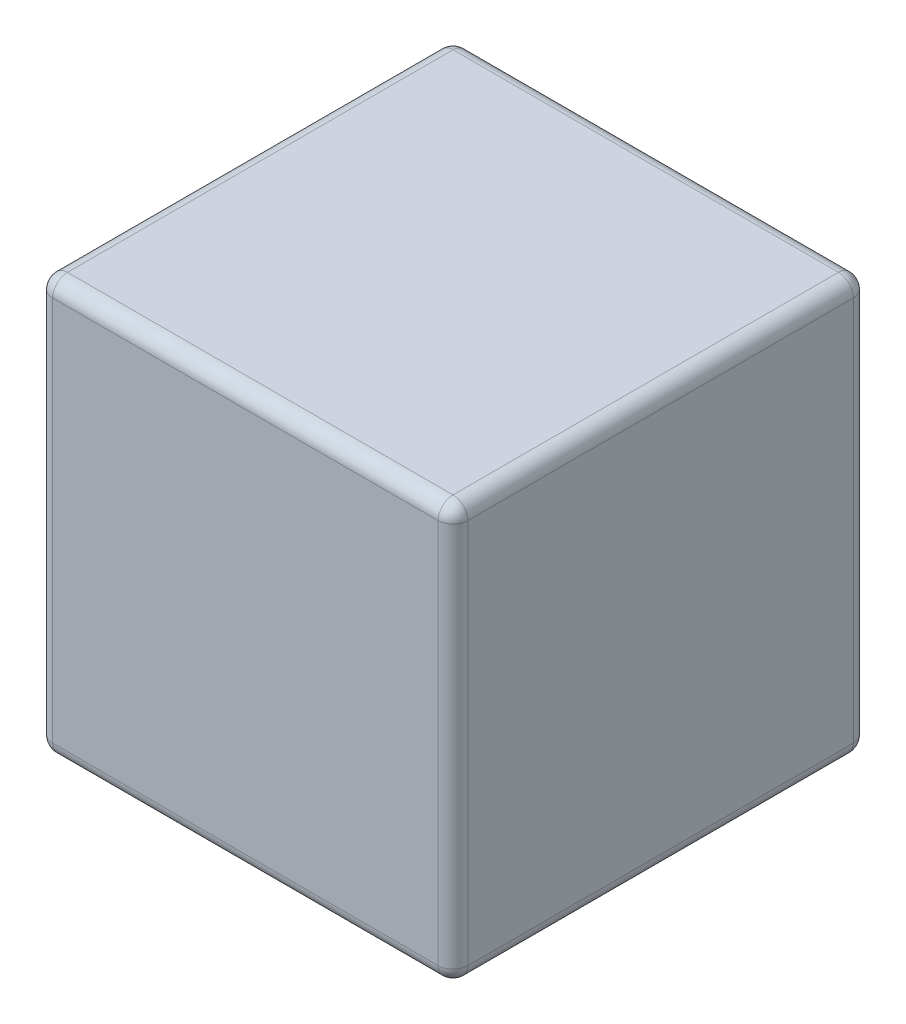
ISO-10303-21;
HEADER;
FILE_DESCRIPTION(('STEP AP214'),'2;1');
FILE_NAME('part.step','',(''),(''),'','','');
FILE_SCHEMA(('AUTOMOTIVE_DESIGN { 1 0 10303 214 1 1 1 1 }'));
ENDSEC;
DATA;
#1=APPLICATION_CONTEXT('core data for automotive mechanical design processes');
#2=APPLICATION_PROTOCOL_DEFINITION('international standard','automotive_design',2000,#1);
#3=PRODUCT_CONTEXT('',#1,'mechanical');
#4=PRODUCT('Part','Part','',(#3));
#5=PRODUCT_RELATED_PRODUCT_CATEGORY('part','',(#4));
#6=PRODUCT_DEFINITION_FORMATION('','',#4);
#7=PRODUCT_DEFINITION_CONTEXT('part definition',#1,'design');
#8=PRODUCT_DEFINITION('design','',#6,#7);
#9=PRODUCT_DEFINITION_SHAPE('','',#8);
#10=(LENGTH_UNIT() NAMED_UNIT(*) SI_UNIT(.MILLI.,.METRE.));
#11=(NAMED_UNIT(*) PLANE_ANGLE_UNIT() SI_UNIT($,.RADIAN.));
#12=(NAMED_UNIT(*) SI_UNIT($,.STERADIAN.) SOLID_ANGLE_UNIT());
#13=UNCERTAINTY_MEASURE_WITH_UNIT(LENGTH_MEASURE(1.E-05),#10,'distance_accuracy_value','');
#14=(GEOMETRIC_REPRESENTATION_CONTEXT(3) GLOBAL_UNCERTAINTY_ASSIGNED_CONTEXT((#13)) GLOBAL_UNIT_ASSIGNED_CONTEXT((#10,
#11,#12)) REPRESENTATION_CONTEXT('',''));
#15=CARTESIAN_POINT('',(0.,0.,0.));
#16=DIRECTION('',(0.,0.,1.));
#17=DIRECTION('',(1.,0.,0.));
#18=AXIS2_PLACEMENT_3D('',#15,#16,#17);
#19=CARTESIAN_POINT('',(28.,28.,-28.));
#20=DIRECTION('',(-1.,0.,0.));
#21=DIRECTION('',(0.,0.,1.));
#22=AXIS2_PLACEMENT_3D('',#19,#20,#21);
#23=PLANE('',#22);
#24=DIRECTION('',(0.,-1.,0.));
#25=VECTOR('',#24,1.);
#26=CARTESIAN_POINT('',(28.,28.,26.));
#27=LINE('',#26,#25);
#28=CARTESIAN_POINT('',(28.,26.,26.));
#29=VERTEX_POINT('',#28);
#30=CARTESIAN_POINT('',(28.,-26.,26.));
#31=VERTEX_POINT('',#30);
#32=EDGE_CURVE('E174',#29,#31,#27,.T.);
#33=ORIENTED_EDGE('',*,*,#32,.T.);
#34=DIRECTION('',(0.,0.,-1.));
#35=VECTOR('',#34,1.);
#36=CARTESIAN_POINT('',(28.,-26.,-28.));
#37=LINE('',#36,#35);
#38=CARTESIAN_POINT('',(28.,-26.,-26.));
#39=VERTEX_POINT('',#38);
#40=EDGE_CURVE('E179',#31,#39,#37,.T.);
#41=ORIENTED_EDGE('',*,*,#40,.T.);
#42=DIRECTION('',(0.,-1.,0.));
#43=VECTOR('',#42,1.);
#44=CARTESIAN_POINT('',(28.,28.,-26.));
#45=LINE('',#44,#43);
#46=CARTESIAN_POINT('',(28.,26.,-26.));
#47=VERTEX_POINT('',#46);
#48=EDGE_CURVE('E176',#39,#47,#45,.F.);
#49=ORIENTED_EDGE('',*,*,#48,.T.);
#50=DIRECTION('',(0.,0.,-1.));
#51=VECTOR('',#50,1.);
#52=CARTESIAN_POINT('',(28.,26.,28.));
#53=LINE('',#52,#51);
#54=EDGE_CURVE('E172',#47,#29,#53,.F.);
#55=ORIENTED_EDGE('',*,*,#54,.T.);
#56=EDGE_LOOP('',(#33,#41,#49,#55));
#57=FACE_BOUND('',#56,.T.);
#58=ADVANCED_FACE('F32',(#57),#23,.F.);
#59=CARTESIAN_POINT('',(-28.,28.,-28.));
#60=DIRECTION('',(0.,0.,1.));
#61=DIRECTION('',(1.,0.,0.));
#62=AXIS2_PLACEMENT_3D('',#59,#60,#61);
#63=PLANE('',#62);
#64=DIRECTION('',(0.,-1.,0.));
#65=VECTOR('',#64,1.);
#66=CARTESIAN_POINT('',(26.,28.,-28.));
#67=LINE('',#66,#65);
#68=CARTESIAN_POINT('',(26.,26.,-28.));
#69=VERTEX_POINT('',#68);
#70=CARTESIAN_POINT('',(26.,-26.,-28.));
#71=VERTEX_POINT('',#70);
#72=EDGE_CURVE('E165',#69,#71,#67,.T.);
#73=ORIENTED_EDGE('',*,*,#72,.T.);
#74=DIRECTION('',(-1.,0.,0.));
#75=VECTOR('',#74,1.);
#76=CARTESIAN_POINT('',(-28.,-26.,-28.));
#77=LINE('',#76,#75);
#78=CARTESIAN_POINT('',(-26.,-26.,-28.));
#79=VERTEX_POINT('',#78);
#80=EDGE_CURVE('E170',#71,#79,#77,.T.);
#81=ORIENTED_EDGE('',*,*,#80,.T.);
#82=DIRECTION('',(0.,-1.,0.));
#83=VECTOR('',#82,1.);
#84=CARTESIAN_POINT('',(-26.,28.,-28.));
#85=LINE('',#84,#83);
#86=CARTESIAN_POINT('',(-26.,26.,-28.));
#87=VERTEX_POINT('',#86);
#88=EDGE_CURVE('E167',#79,#87,#85,.F.);
#89=ORIENTED_EDGE('',*,*,#88,.T.);
#90=DIRECTION('',(-1.,0.,0.));
#91=VECTOR('',#90,1.);
#92=CARTESIAN_POINT('',(28.,26.,-28.));
#93=LINE('',#92,#91);
#94=EDGE_CURVE('E163',#87,#69,#93,.F.);
#95=ORIENTED_EDGE('',*,*,#94,.T.);
#96=EDGE_LOOP('',(#73,#81,#89,#95));
#97=FACE_BOUND('',#96,.T.);
#98=ADVANCED_FACE('F303',(#97),#63,.F.);
#99=CARTESIAN_POINT('',(-28.,28.,-28.));
#100=DIRECTION('',(1.,0.,0.));
#101=DIRECTION('',(0.,0.,-1.));
#102=AXIS2_PLACEMENT_3D('',#99,#100,#101);
#103=PLANE('',#102);
#104=DIRECTION('',(0.,-1.,0.));
#105=VECTOR('',#104,1.);
#106=CARTESIAN_POINT('',(-28.,28.,-26.));
#107=LINE('',#106,#105);
#108=CARTESIAN_POINT('',(-28.,26.,-26.));
#109=VERTEX_POINT('',#108);
#110=CARTESIAN_POINT('',(-28.,-26.,-26.));
#111=VERTEX_POINT('',#110);
#112=EDGE_CURVE('E131',#109,#111,#107,.T.);
#113=ORIENTED_EDGE('',*,*,#112,.T.);
#114=DIRECTION('',(0.,0.,1.));
#115=VECTOR('',#114,1.);
#116=CARTESIAN_POINT('',(-28.,-26.,-28.));
#117=LINE('',#116,#115);
#118=CARTESIAN_POINT('',(-28.,-26.,26.));
#119=VERTEX_POINT('',#118);
#120=EDGE_CURVE('E127',#111,#119,#117,.T.);
#121=ORIENTED_EDGE('',*,*,#120,.T.);
#122=DIRECTION('',(0.,-1.,0.));
#123=VECTOR('',#122,1.);
#124=CARTESIAN_POINT('',(-28.,28.,26.));
#125=LINE('',#124,#123);
#126=CARTESIAN_POINT('',(-28.,26.,26.));
#127=VERTEX_POINT('',#126);
#128=EDGE_CURVE('E119',#119,#127,#125,.F.);
#129=ORIENTED_EDGE('',*,*,#128,.T.);
#130=DIRECTION('',(0.,0.,1.));
#131=VECTOR('',#130,1.);
#132=CARTESIAN_POINT('',(-28.,26.,-28.));
#133=LINE('',#132,#131);
#134=EDGE_CURVE('E124',#127,#109,#133,.F.);
#135=ORIENTED_EDGE('',*,*,#134,.T.);
#136=EDGE_LOOP('',(#113,#121,#129,#135));
#137=FACE_BOUND('',#136,.T.);
#138=ADVANCED_FACE('F122',(#137),#103,.F.);
#139=CARTESIAN_POINT('',(-28.,28.,28.));
#140=DIRECTION('',(0.,0.,-1.));
#141=DIRECTION('',(-1.,0.,0.));
#142=AXIS2_PLACEMENT_3D('',#139,#140,#141);
#143=PLANE('',#142);
#144=DIRECTION('',(0.,-1.,0.));
#145=VECTOR('',#144,1.);
#146=CARTESIAN_POINT('',(-26.,28.,28.));
#147=LINE('',#146,#145);
#148=CARTESIAN_POINT('',(-26.,26.,28.));
#149=VERTEX_POINT('',#148);
#150=CARTESIAN_POINT('',(-26.,-26.,28.));
#151=VERTEX_POINT('',#150);
#152=EDGE_CURVE('E139',#149,#151,#147,.T.);
#153=ORIENTED_EDGE('',*,*,#152,.T.);
#154=DIRECTION('',(1.,0.,0.));
#155=VECTOR('',#154,1.);
#156=CARTESIAN_POINT('',(-28.,-26.,28.));
#157=LINE('',#156,#155);
#158=CARTESIAN_POINT('',(26.,-26.,28.));
#159=VERTEX_POINT('',#158);
#160=EDGE_CURVE('E186',#151,#159,#157,.T.);
#161=ORIENTED_EDGE('',*,*,#160,.T.);
#162=DIRECTION('',(0.,-1.,0.));
#163=VECTOR('',#162,1.);
#164=CARTESIAN_POINT('',(26.,28.,28.));
#165=LINE('',#164,#163);
#166=CARTESIAN_POINT('',(26.,26.,28.));
#167=VERTEX_POINT('',#166);
#168=EDGE_CURVE('E183',#159,#167,#165,.F.);
#169=ORIENTED_EDGE('',*,*,#168,.T.);
#170=DIRECTION('',(1.,0.,0.));
#171=VECTOR('',#170,1.);
#172=CARTESIAN_POINT('',(-28.,26.,28.));
#173=LINE('',#172,#171);
#174=EDGE_CURVE('E181',#167,#149,#173,.F.);
#175=ORIENTED_EDGE('',*,*,#174,.T.);
#176=EDGE_LOOP('',(#153,#161,#169,#175));
#177=FACE_BOUND('',#176,.T.);
#178=ADVANCED_FACE('F294',(#177),#143,.F.);
#179=CARTESIAN_POINT('',(0.,28.,0.));
#180=DIRECTION('',(0.,1.,0.));
#181=DIRECTION('',(0.,0.,1.));
#182=AXIS2_PLACEMENT_3D('',#179,#180,#181);
#183=PLANE('',#182);
#184=DIRECTION('',(0.,0.,1.));
#185=VECTOR('',#184,1.);
#186=CARTESIAN_POINT('',(-26.,28.,28.));
#187=LINE('',#186,#185);
#188=CARTESIAN_POINT('',(-26.,28.,-26.));
#189=VERTEX_POINT('',#188);
#190=CARTESIAN_POINT('',(-26.,28.,26.));
#191=VERTEX_POINT('',#190);
#192=EDGE_CURVE('E41',#189,#191,#187,.T.);
#193=ORIENTED_EDGE('',*,*,#192,.T.);
#194=DIRECTION('',(1.,0.,0.));
#195=VECTOR('',#194,1.);
#196=CARTESIAN_POINT('',(28.,28.,26.));
#197=LINE('',#196,#195);
#198=CARTESIAN_POINT('',(26.,28.,26.));
#199=VERTEX_POINT('',#198);
#200=EDGE_CURVE('E11',#191,#199,#197,.T.);
#201=ORIENTED_EDGE('',*,*,#200,.T.);
#202=DIRECTION('',(0.,0.,-1.));
#203=VECTOR('',#202,1.);
#204=CARTESIAN_POINT('',(26.,28.,-28.));
#205=LINE('',#204,#203);
#206=CARTESIAN_POINT('',(26.,28.,-26.));
#207=VERTEX_POINT('',#206);
#208=EDGE_CURVE('E197',#199,#207,#205,.T.);
#209=ORIENTED_EDGE('',*,*,#208,.T.);
#210=DIRECTION('',(-1.,0.,0.));
#211=VECTOR('',#210,1.);
#212=CARTESIAN_POINT('',(-28.,28.,-26.));
#213=LINE('',#212,#211);
#214=EDGE_CURVE('E52',#207,#189,#213,.T.);
#215=ORIENTED_EDGE('',*,*,#214,.T.);
#216=EDGE_LOOP('',(#193,#201,#209,#215));
#217=FACE_BOUND('',#216,.T.);
#218=ADVANCED_FACE('F296',(#217),#183,.T.);
#219=CARTESIAN_POINT('',(0.,-28.,0.));
#220=DIRECTION('',(0.,1.,0.));
#221=DIRECTION('',(0.,0.,1.));
#222=AXIS2_PLACEMENT_3D('',#219,#220,#221);
#223=PLANE('',#222);
#224=DIRECTION('',(0.,0.,1.));
#225=VECTOR('',#224,1.);
#226=CARTESIAN_POINT('',(-26.,-28.,0.));
#227=LINE('',#226,#225);
#228=CARTESIAN_POINT('',(-26.,-28.,26.));
#229=VERTEX_POINT('',#228);
#230=CARTESIAN_POINT('',(-26.,-28.,-26.));
#231=VERTEX_POINT('',#230);
#232=EDGE_CURVE('E192',#229,#231,#227,.F.);
#233=ORIENTED_EDGE('',*,*,#232,.T.);
#234=DIRECTION('',(-1.,0.,0.));
#235=VECTOR('',#234,1.);
#236=CARTESIAN_POINT('',(0.,-28.,-26.));
#237=LINE('',#236,#235);
#238=CARTESIAN_POINT('',(26.,-28.,-26.));
#239=VERTEX_POINT('',#238);
#240=EDGE_CURVE('E194',#231,#239,#237,.F.);
#241=ORIENTED_EDGE('',*,*,#240,.T.);
#242=DIRECTION('',(0.,0.,-1.));
#243=VECTOR('',#242,1.);
#244=CARTESIAN_POINT('',(26.,-28.,0.));
#245=LINE('',#244,#243);
#246=CARTESIAN_POINT('',(26.,-28.,26.));
#247=VERTEX_POINT('',#246);
#248=EDGE_CURVE('E188',#239,#247,#245,.F.);
#249=ORIENTED_EDGE('',*,*,#248,.T.);
#250=DIRECTION('',(1.,0.,0.));
#251=VECTOR('',#250,1.);
#252=CARTESIAN_POINT('',(0.,-28.,26.));
#253=LINE('',#252,#251);
#254=EDGE_CURVE('E190',#247,#229,#253,.F.);
#255=ORIENTED_EDGE('',*,*,#254,.T.);
#256=EDGE_LOOP('',(#233,#241,#249,#255));
#257=FACE_BOUND('',#256,.T.);
#258=ADVANCED_FACE('F264',(#257),#223,.F.);
#259=CARTESIAN_POINT('',(26.,28.,26.));
#260=DIRECTION('',(0.,-1.,0.));
#261=DIRECTION('',(0.,0.,-1.));
#262=AXIS2_PLACEMENT_3D('',#259,#260,#261);
#263=CYLINDRICAL_SURFACE('',#262,2.);
#264=CARTESIAN_POINT('',(26.,26.,26.));
#265=DIRECTION('',(0.,1.,0.));
#266=DIRECTION('',(0.,0.,1.));
#267=AXIS2_PLACEMENT_3D('',#264,#265,#266);
#268=CIRCLE('',#267,2.);
#269=EDGE_CURVE('E36',#167,#29,#268,.T.);
#270=ORIENTED_EDGE('',*,*,#269,.F.);
#271=ORIENTED_EDGE('',*,*,#168,.F.);
#272=CARTESIAN_POINT('',(26.,-26.,26.));
#273=DIRECTION('',(0.,-1.,0.));
#274=DIRECTION('',(0.,0.,-1.));
#275=AXIS2_PLACEMENT_3D('',#272,#273,#274);
#276=CIRCLE('',#275,2.);
#277=EDGE_CURVE('E159',#31,#159,#276,.T.);
#278=ORIENTED_EDGE('',*,*,#277,.F.);
#279=ORIENTED_EDGE('',*,*,#32,.F.);
#280=EDGE_LOOP('',(#270,#271,#278,#279));
#281=FACE_BOUND('',#280,.T.);
#282=ADVANCED_FACE('F34',(#281),#263,.T.);
#283=CARTESIAN_POINT('',(26.,26.,26.));
#284=DIRECTION('',(0.,0.,1.));
#285=DIRECTION('',(1.,0.,0.));
#286=AXIS2_PLACEMENT_3D('',#283,#284,#285);
#287=SPHERICAL_SURFACE('',#286,2.);
#288=CARTESIAN_POINT('',(26.,26.,26.));
#289=DIRECTION('',(1.,0.,0.));
#290=DIRECTION('',(0.,0.,-1.));
#291=AXIS2_PLACEMENT_3D('',#288,#289,#290);
#292=CIRCLE('',#291,2.);
#293=EDGE_CURVE('E242',#167,#199,#292,.F.);
#294=ORIENTED_EDGE('',*,*,#293,.F.);
#295=ORIENTED_EDGE('',*,*,#269,.T.);
#296=CARTESIAN_POINT('',(26.,26.,26.));
#297=DIRECTION('',(0.,0.,1.));
#298=DIRECTION('',(1.,0.,0.));
#299=AXIS2_PLACEMENT_3D('',#296,#297,#298);
#300=CIRCLE('',#299,2.);
#301=EDGE_CURVE('E245',#199,#29,#300,.F.);
#302=ORIENTED_EDGE('',*,*,#301,.F.);
#303=EDGE_LOOP('',(#294,#295,#302));
#304=FACE_BOUND('',#303,.T.);
#305=ADVANCED_FACE('F289',(#304),#287,.T.);
#306=CARTESIAN_POINT('',(26.,-26.,26.));
#307=DIRECTION('',(0.,0.,1.));
#308=DIRECTION('',(1.,0.,0.));
#309=AXIS2_PLACEMENT_3D('',#306,#307,#308);
#310=SPHERICAL_SURFACE('',#309,2.);
#311=CARTESIAN_POINT('',(26.,-26.,26.));
#312=DIRECTION('',(0.,0.,1.));
#313=DIRECTION('',(1.,0.,0.));
#314=AXIS2_PLACEMENT_3D('',#311,#312,#313);
#315=CIRCLE('',#314,2.);
#316=EDGE_CURVE('E236',#31,#247,#315,.F.);
#317=ORIENTED_EDGE('',*,*,#316,.F.);
#318=ORIENTED_EDGE('',*,*,#277,.T.);
#319=CARTESIAN_POINT('',(26.,-26.,26.));
#320=DIRECTION('',(1.,0.,0.));
#321=DIRECTION('',(0.,0.,-1.));
#322=AXIS2_PLACEMENT_3D('',#319,#320,#321);
#323=CIRCLE('',#322,2.);
#324=EDGE_CURVE('E239',#247,#159,#323,.F.);
#325=ORIENTED_EDGE('',*,*,#324,.F.);
#326=EDGE_LOOP('',(#317,#318,#325));
#327=FACE_BOUND('',#326,.T.);
#328=ADVANCED_FACE('F252',(#327),#310,.T.);
#329=CARTESIAN_POINT('',(26.,26.,0.));
#330=DIRECTION('',(0.,0.,1.));
#331=DIRECTION('',(1.,0.,0.));
#332=AXIS2_PLACEMENT_3D('',#329,#330,#331);
#333=CYLINDRICAL_SURFACE('',#332,2.);
#334=ORIENTED_EDGE('',*,*,#301,.T.);
#335=ORIENTED_EDGE('',*,*,#54,.F.);
#336=CARTESIAN_POINT('',(26.,26.,-26.));
#337=DIRECTION('',(0.,0.,-1.));
#338=DIRECTION('',(-1.,0.,0.));
#339=AXIS2_PLACEMENT_3D('',#336,#337,#338);
#340=CIRCLE('',#339,2.);
#341=EDGE_CURVE('E231',#207,#47,#340,.T.);
#342=ORIENTED_EDGE('',*,*,#341,.F.);
#343=ORIENTED_EDGE('',*,*,#208,.F.);
#344=EDGE_LOOP('',(#334,#335,#342,#343));
#345=FACE_BOUND('',#344,.T.);
#346=ADVANCED_FACE('F284',(#345),#333,.T.);
#347=CARTESIAN_POINT('',(0.,26.,26.));
#348=DIRECTION('',(-1.,0.,0.));
#349=DIRECTION('',(0.,0.,1.));
#350=AXIS2_PLACEMENT_3D('',#347,#348,#349);
#351=CYLINDRICAL_SURFACE('',#350,2.);
#352=ORIENTED_EDGE('',*,*,#293,.T.);
#353=ORIENTED_EDGE('',*,*,#200,.F.);
#354=CARTESIAN_POINT('',(-26.,26.,26.));
#355=DIRECTION('',(-1.,0.,0.));
#356=DIRECTION('',(0.,0.,1.));
#357=AXIS2_PLACEMENT_3D('',#354,#355,#356);
#358=CIRCLE('',#357,2.);
#359=EDGE_CURVE('E143',#149,#191,#358,.T.);
#360=ORIENTED_EDGE('',*,*,#359,.F.);
#361=ORIENTED_EDGE('',*,*,#174,.F.);
#362=EDGE_LOOP('',(#352,#353,#360,#361));
#363=FACE_BOUND('',#362,.T.);
#364=ADVANCED_FACE('F292',(#363),#351,.T.);
#365=CARTESIAN_POINT('',(-26.,28.,26.));
#366=DIRECTION('',(0.,-1.,0.));
#367=DIRECTION('',(0.,0.,-1.));
#368=AXIS2_PLACEMENT_3D('',#365,#366,#367);
#369=CYLINDRICAL_SURFACE('',#368,2.);
#370=CARTESIAN_POINT('',(-26.,-26.,26.));
#371=DIRECTION('',(0.,-1.,0.));
#372=DIRECTION('',(0.,0.,-1.));
#373=AXIS2_PLACEMENT_3D('',#370,#371,#372);
#374=CIRCLE('',#373,2.);
#375=EDGE_CURVE('E144',#151,#119,#374,.T.);
#376=ORIENTED_EDGE('',*,*,#375,.F.);
#377=ORIENTED_EDGE('',*,*,#152,.F.);
#378=CARTESIAN_POINT('',(-26.,26.,26.));
#379=DIRECTION('',(0.,1.,0.));
#380=DIRECTION('',(0.,0.,1.));
#381=AXIS2_PLACEMENT_3D('',#378,#379,#380);
#382=CIRCLE('',#381,2.);
#383=EDGE_CURVE('E135',#127,#149,#382,.T.);
#384=ORIENTED_EDGE('',*,*,#383,.F.);
#385=ORIENTED_EDGE('',*,*,#128,.F.);
#386=EDGE_LOOP('',(#376,#377,#384,#385));
#387=FACE_BOUND('',#386,.T.);
#388=ADVANCED_FACE('F137',(#387),#369,.T.);
#389=CARTESIAN_POINT('',(-28.,-26.,26.));
#390=DIRECTION('',(1.,0.,0.));
#391=DIRECTION('',(0.,0.,-1.));
#392=AXIS2_PLACEMENT_3D('',#389,#390,#391);
#393=CYLINDRICAL_SURFACE('',#392,2.);
#394=ORIENTED_EDGE('',*,*,#324,.T.);
#395=ORIENTED_EDGE('',*,*,#160,.F.);
#396=CARTESIAN_POINT('',(-26.,-26.,26.));
#397=DIRECTION('',(-1.,0.,0.));
#398=DIRECTION('',(0.,0.,1.));
#399=AXIS2_PLACEMENT_3D('',#396,#397,#398);
#400=CIRCLE('',#399,2.);
#401=EDGE_CURVE('E227',#229,#151,#400,.T.);
#402=ORIENTED_EDGE('',*,*,#401,.F.);
#403=ORIENTED_EDGE('',*,*,#254,.F.);
#404=EDGE_LOOP('',(#394,#395,#402,#403));
#405=FACE_BOUND('',#404,.T.);
#406=ADVANCED_FACE('F260',(#405),#393,.T.);
#407=CARTESIAN_POINT('',(26.,-26.,-28.));
#408=DIRECTION('',(0.,0.,-1.));
#409=DIRECTION('',(-1.,0.,0.));
#410=AXIS2_PLACEMENT_3D('',#407,#408,#409);
#411=CYLINDRICAL_SURFACE('',#410,2.);
#412=ORIENTED_EDGE('',*,*,#316,.T.);
#413=ORIENTED_EDGE('',*,*,#248,.F.);
#414=CARTESIAN_POINT('',(26.,-26.,-26.));
#415=DIRECTION('',(0.,0.,-1.));
#416=DIRECTION('',(-1.,0.,0.));
#417=AXIS2_PLACEMENT_3D('',#414,#415,#416);
#418=CIRCLE('',#417,2.);
#419=EDGE_CURVE('E224',#39,#239,#418,.T.);
#420=ORIENTED_EDGE('',*,*,#419,.F.);
#421=ORIENTED_EDGE('',*,*,#40,.F.);
#422=EDGE_LOOP('',(#412,#413,#420,#421));
#423=FACE_BOUND('',#422,.T.);
#424=ADVANCED_FACE('F270',(#423),#411,.T.);
#425=CARTESIAN_POINT('',(26.,28.,-26.));
#426=DIRECTION('',(0.,-1.,0.));
#427=DIRECTION('',(0.,0.,-1.));
#428=AXIS2_PLACEMENT_3D('',#425,#426,#427);
#429=CYLINDRICAL_SURFACE('',#428,2.);
#430=CARTESIAN_POINT('',(26.,26.,-26.));
#431=DIRECTION('',(0.,1.,0.));
#432=DIRECTION('',(0.,0.,1.));
#433=AXIS2_PLACEMENT_3D('',#430,#431,#432);
#434=CIRCLE('',#433,2.);
#435=EDGE_CURVE('E233',#47,#69,#434,.T.);
#436=ORIENTED_EDGE('',*,*,#435,.F.);
#437=ORIENTED_EDGE('',*,*,#48,.F.);
#438=CARTESIAN_POINT('',(26.,-26.,-26.));
#439=DIRECTION('',(0.,-1.,0.));
#440=DIRECTION('',(0.,0.,-1.));
#441=AXIS2_PLACEMENT_3D('',#438,#439,#440);
#442=CIRCLE('',#441,2.);
#443=EDGE_CURVE('E221',#71,#39,#442,.T.);
#444=ORIENTED_EDGE('',*,*,#443,.F.);
#445=ORIENTED_EDGE('',*,*,#72,.F.);
#446=EDGE_LOOP('',(#436,#437,#444,#445));
#447=FACE_BOUND('',#446,.T.);
#448=ADVANCED_FACE('F276',(#447),#429,.T.);
#449=CARTESIAN_POINT('',(26.,26.,-26.));
#450=DIRECTION('',(0.,0.,1.));
#451=DIRECTION('',(1.,0.,0.));
#452=AXIS2_PLACEMENT_3D('',#449,#450,#451);
#453=SPHERICAL_SURFACE('',#452,2.);
#454=ORIENTED_EDGE('',*,*,#341,.T.);
#455=ORIENTED_EDGE('',*,*,#435,.T.);
#456=CARTESIAN_POINT('',(26.,26.,-26.));
#457=DIRECTION('',(1.,0.,0.));
#458=DIRECTION('',(0.,1.,0.));
#459=AXIS2_PLACEMENT_3D('',#456,#457,#458);
#460=CIRCLE('',#459,2.);
#461=EDGE_CURVE('E150',#207,#69,#460,.F.);
#462=ORIENTED_EDGE('',*,*,#461,.F.);
#463=EDGE_LOOP('',(#454,#455,#462));
#464=FACE_BOUND('',#463,.T.);
#465=ADVANCED_FACE('F350',(#464),#453,.T.);
#466=CARTESIAN_POINT('',(-26.,26.,26.));
#467=DIRECTION('',(0.,0.,1.));
#468=DIRECTION('',(1.,0.,0.));
#469=AXIS2_PLACEMENT_3D('',#466,#467,#468);
#470=SPHERICAL_SURFACE('',#469,2.);
#471=ORIENTED_EDGE('',*,*,#383,.T.);
#472=ORIENTED_EDGE('',*,*,#359,.T.);
#473=CARTESIAN_POINT('',(-26.,26.,26.));
#474=DIRECTION('',(0.,0.,1.));
#475=DIRECTION('',(1.,0.,0.));
#476=AXIS2_PLACEMENT_3D('',#473,#474,#475);
#477=CIRCLE('',#476,2.);
#478=EDGE_CURVE('E147',#127,#191,#477,.F.);
#479=ORIENTED_EDGE('',*,*,#478,.F.);
#480=EDGE_LOOP('',(#471,#472,#479));
#481=FACE_BOUND('',#480,.T.);
#482=ADVANCED_FACE('F148',(#481),#470,.T.);
#483=CARTESIAN_POINT('',(-26.,-26.,26.));
#484=DIRECTION('',(0.,0.,1.));
#485=DIRECTION('',(1.,0.,0.));
#486=AXIS2_PLACEMENT_3D('',#483,#484,#485);
#487=SPHERICAL_SURFACE('',#486,2.);
#488=ORIENTED_EDGE('',*,*,#401,.T.);
#489=ORIENTED_EDGE('',*,*,#375,.T.);
#490=CARTESIAN_POINT('',(-26.,-26.,26.));
#491=DIRECTION('',(0.,0.,1.));
#492=DIRECTION('',(1.,0.,0.));
#493=AXIS2_PLACEMENT_3D('',#490,#491,#492);
#494=CIRCLE('',#493,2.);
#495=EDGE_CURVE('E151',#229,#119,#494,.F.);
#496=ORIENTED_EDGE('',*,*,#495,.F.);
#497=EDGE_LOOP('',(#488,#489,#496));
#498=FACE_BOUND('',#497,.T.);
#499=ADVANCED_FACE('F343',(#498),#487,.T.);
#500=CARTESIAN_POINT('',(26.,-26.,-26.));
#501=DIRECTION('',(0.,0.,1.));
#502=DIRECTION('',(1.,0.,0.));
#503=AXIS2_PLACEMENT_3D('',#500,#501,#502);
#504=SPHERICAL_SURFACE('',#503,2.);
#505=ORIENTED_EDGE('',*,*,#443,.T.);
#506=ORIENTED_EDGE('',*,*,#419,.T.);
#507=CARTESIAN_POINT('',(26.,-26.,-26.));
#508=DIRECTION('',(1.,0.,0.));
#509=DIRECTION('',(0.,0.,-1.));
#510=AXIS2_PLACEMENT_3D('',#507,#508,#509);
#511=CIRCLE('',#510,2.);
#512=EDGE_CURVE('E215',#71,#239,#511,.F.);
#513=ORIENTED_EDGE('',*,*,#512,.F.);
#514=EDGE_LOOP('',(#505,#506,#513));
#515=FACE_BOUND('',#514,.T.);
#516=ADVANCED_FACE('F339',(#515),#504,.T.);
#517=CARTESIAN_POINT('',(0.,26.,-26.));
#518=DIRECTION('',(1.,0.,0.));
#519=DIRECTION('',(0.,0.,-1.));
#520=AXIS2_PLACEMENT_3D('',#517,#518,#519);
#521=CYLINDRICAL_SURFACE('',#520,2.);
#522=ORIENTED_EDGE('',*,*,#461,.T.);
#523=ORIENTED_EDGE('',*,*,#94,.F.);
#524=CARTESIAN_POINT('',(-26.,26.,-26.));
#525=DIRECTION('',(-1.,0.,0.));
#526=DIRECTION('',(0.,0.,1.));
#527=AXIS2_PLACEMENT_3D('',#524,#525,#526);
#528=CIRCLE('',#527,2.);
#529=EDGE_CURVE('E212',#189,#87,#528,.T.);
#530=ORIENTED_EDGE('',*,*,#529,.F.);
#531=ORIENTED_EDGE('',*,*,#214,.F.);
#532=EDGE_LOOP('',(#522,#523,#530,#531));
#533=FACE_BOUND('',#532,.T.);
#534=ADVANCED_FACE('F336',(#533),#521,.T.);
#535=CARTESIAN_POINT('',(-26.,26.,0.));
#536=DIRECTION('',(0.,0.,-1.));
#537=DIRECTION('',(-1.,0.,0.));
#538=AXIS2_PLACEMENT_3D('',#535,#536,#537);
#539=CYLINDRICAL_SURFACE('',#538,2.);
#540=ORIENTED_EDGE('',*,*,#478,.T.);
#541=ORIENTED_EDGE('',*,*,#192,.F.);
#542=CARTESIAN_POINT('',(-26.,26.,-26.));
#543=DIRECTION('',(0.,0.,-1.));
#544=DIRECTION('',(-1.,0.,0.));
#545=AXIS2_PLACEMENT_3D('',#542,#543,#544);
#546=CIRCLE('',#545,2.);
#547=EDGE_CURVE('E155',#109,#189,#546,.T.);
#548=ORIENTED_EDGE('',*,*,#547,.F.);
#549=ORIENTED_EDGE('',*,*,#134,.F.);
#550=EDGE_LOOP('',(#540,#541,#548,#549));
#551=FACE_BOUND('',#550,.T.);
#552=ADVANCED_FACE('F153',(#551),#539,.T.);
#553=CARTESIAN_POINT('',(-26.,-26.,-28.));
#554=DIRECTION('',(0.,0.,1.));
#555=DIRECTION('',(1.,0.,0.));
#556=AXIS2_PLACEMENT_3D('',#553,#554,#555);
#557=CYLINDRICAL_SURFACE('',#556,2.);
#558=ORIENTED_EDGE('',*,*,#495,.T.);
#559=ORIENTED_EDGE('',*,*,#120,.F.);
#560=CARTESIAN_POINT('',(-26.,-26.,-26.));
#561=DIRECTION('',(0.,0.,-1.));
#562=DIRECTION('',(-1.,0.,0.));
#563=AXIS2_PLACEMENT_3D('',#560,#561,#562);
#564=CIRCLE('',#563,2.);
#565=EDGE_CURVE('E208',#231,#111,#564,.T.);
#566=ORIENTED_EDGE('',*,*,#565,.F.);
#567=ORIENTED_EDGE('',*,*,#232,.F.);
#568=EDGE_LOOP('',(#558,#559,#566,#567));
#569=FACE_BOUND('',#568,.T.);
#570=ADVANCED_FACE('F329',(#569),#557,.T.);
#571=CARTESIAN_POINT('',(-28.,-26.,-26.));
#572=DIRECTION('',(-1.,0.,0.));
#573=DIRECTION('',(0.,0.,1.));
#574=AXIS2_PLACEMENT_3D('',#571,#572,#573);
#575=CYLINDRICAL_SURFACE('',#574,2.);
#576=ORIENTED_EDGE('',*,*,#512,.T.);
#577=ORIENTED_EDGE('',*,*,#240,.F.);
#578=CARTESIAN_POINT('',(-26.,-26.,-26.));
#579=DIRECTION('',(-1.,0.,0.));
#580=DIRECTION('',(0.,0.,1.));
#581=AXIS2_PLACEMENT_3D('',#578,#579,#580);
#582=CIRCLE('',#581,2.);
#583=EDGE_CURVE('E205',#79,#231,#582,.T.);
#584=ORIENTED_EDGE('',*,*,#583,.F.);
#585=ORIENTED_EDGE('',*,*,#80,.F.);
#586=EDGE_LOOP('',(#576,#577,#584,#585));
#587=FACE_BOUND('',#586,.T.);
#588=ADVANCED_FACE('F325',(#587),#575,.T.);
#589=CARTESIAN_POINT('',(-26.,26.,-26.));
#590=DIRECTION('',(0.,0.,1.));
#591=DIRECTION('',(1.,0.,0.));
#592=AXIS2_PLACEMENT_3D('',#589,#590,#591);
#593=SPHERICAL_SURFACE('',#592,2.);
#594=ORIENTED_EDGE('',*,*,#547,.T.);
#595=ORIENTED_EDGE('',*,*,#529,.T.);
#596=CARTESIAN_POINT('',(-26.,26.,-26.));
#597=DIRECTION('',(0.,1.,0.));
#598=DIRECTION('',(0.,0.,1.));
#599=AXIS2_PLACEMENT_3D('',#596,#597,#598);
#600=CIRCLE('',#599,2.);
#601=EDGE_CURVE('E203',#109,#87,#600,.F.);
#602=ORIENTED_EDGE('',*,*,#601,.F.);
#603=EDGE_LOOP('',(#594,#595,#602));
#604=FACE_BOUND('',#603,.T.);
#605=ADVANCED_FACE('F321',(#604),#593,.T.);
#606=CARTESIAN_POINT('',(-26.,-26.,-26.));
#607=DIRECTION('',(0.,0.,1.));
#608=DIRECTION('',(1.,0.,0.));
#609=AXIS2_PLACEMENT_3D('',#606,#607,#608);
#610=SPHERICAL_SURFACE('',#609,2.);
#611=ORIENTED_EDGE('',*,*,#583,.T.);
#612=ORIENTED_EDGE('',*,*,#565,.T.);
#613=CARTESIAN_POINT('',(-26.,-26.,-26.));
#614=DIRECTION('',(0.,-1.,0.));
#615=DIRECTION('',(0.,0.,-1.));
#616=AXIS2_PLACEMENT_3D('',#613,#614,#615);
#617=CIRCLE('',#616,2.);
#618=EDGE_CURVE('E201',#79,#111,#617,.F.);
#619=ORIENTED_EDGE('',*,*,#618,.F.);
#620=EDGE_LOOP('',(#611,#612,#619));
#621=FACE_BOUND('',#620,.T.);
#622=ADVANCED_FACE('F317',(#621),#610,.T.);
#623=CARTESIAN_POINT('',(-26.,28.,-26.));
#624=DIRECTION('',(0.,-1.,0.));
#625=DIRECTION('',(0.,0.,-1.));
#626=AXIS2_PLACEMENT_3D('',#623,#624,#625);
#627=CYLINDRICAL_SURFACE('',#626,2.);
#628=ORIENTED_EDGE('',*,*,#601,.T.);
#629=ORIENTED_EDGE('',*,*,#88,.F.);
#630=ORIENTED_EDGE('',*,*,#618,.T.);
#631=ORIENTED_EDGE('',*,*,#112,.F.);
#632=EDGE_LOOP('',(#628,#629,#630,#631));
#633=FACE_BOUND('',#632,.T.);
#634=ADVANCED_FACE('F314',(#633),#627,.T.);
#635=CLOSED_SHELL('',(#58,#98,#138,#178,#218,#258,#282,#305,#328,#346,#364,#388,#406,#424,#448,
#465,#482,#499,#516,#534,#552,#570,#588,#605,#622,#634));
#636=MANIFOLD_SOLID_BREP('B2',#635);
#637=ADVANCED_BREP_SHAPE_REPRESENTATION('',(#18,#636),#14);
#638=SHAPE_DEFINITION_REPRESENTATION(#9,#637);
ENDSEC;
END-ISO-10303-21;
